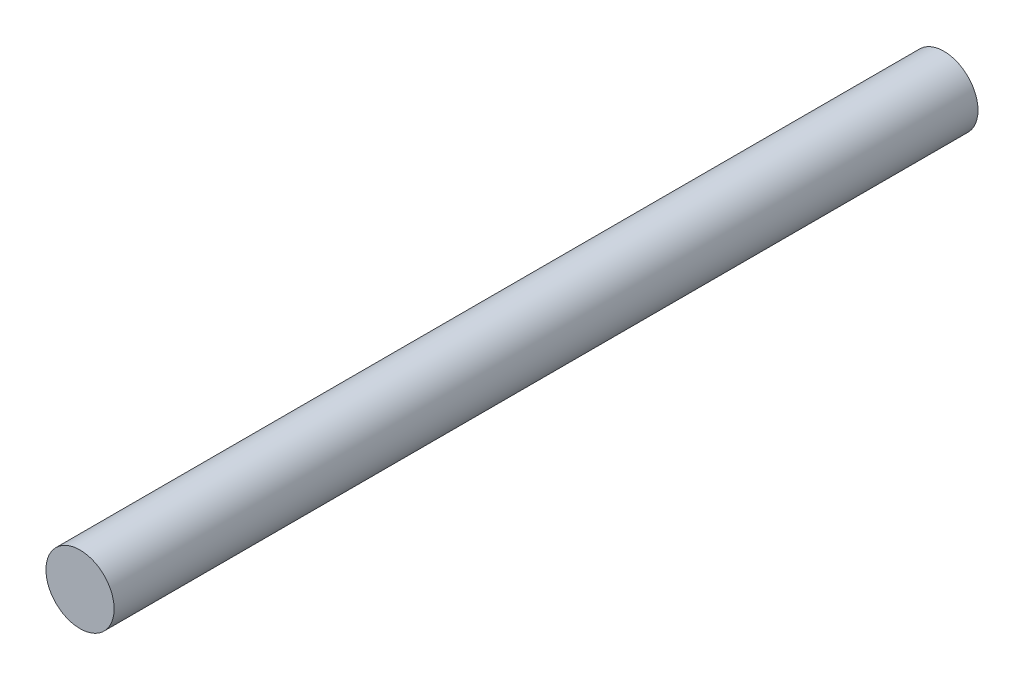
ISO-10303-21;
HEADER;
FILE_DESCRIPTION(('STEP AP214'),'2;1');
FILE_NAME('part.step','',(''),(''),'','','');
FILE_SCHEMA(('AUTOMOTIVE_DESIGN { 1 0 10303 214 1 1 1 1 }'));
ENDSEC;
DATA;
#1=APPLICATION_CONTEXT('core data for automotive mechanical design processes');
#2=APPLICATION_PROTOCOL_DEFINITION('international standard','automotive_design',2000,#1);
#3=PRODUCT_CONTEXT('',#1,'mechanical');
#4=PRODUCT('Part','Part','',(#3));
#5=PRODUCT_RELATED_PRODUCT_CATEGORY('part','',(#4));
#6=PRODUCT_DEFINITION_FORMATION('','',#4);
#7=PRODUCT_DEFINITION_CONTEXT('part definition',#1,'design');
#8=PRODUCT_DEFINITION('design','',#6,#7);
#9=PRODUCT_DEFINITION_SHAPE('','',#8);
#10=(LENGTH_UNIT() NAMED_UNIT(*) SI_UNIT(.MILLI.,.METRE.));
#11=(NAMED_UNIT(*) PLANE_ANGLE_UNIT() SI_UNIT($,.RADIAN.));
#12=(NAMED_UNIT(*) SI_UNIT($,.STERADIAN.) SOLID_ANGLE_UNIT());
#13=UNCERTAINTY_MEASURE_WITH_UNIT(LENGTH_MEASURE(1.E-05),#10,'distance_accuracy_value','');
#14=(GEOMETRIC_REPRESENTATION_CONTEXT(3) GLOBAL_UNCERTAINTY_ASSIGNED_CONTEXT((#13)) GLOBAL_UNIT_ASSIGNED_CONTEXT((#10,
#11,#12)) REPRESENTATION_CONTEXT('',''));
#15=CARTESIAN_POINT('',(0.,0.,0.));
#16=DIRECTION('',(0.,0.,1.));
#17=DIRECTION('',(1.,0.,0.));
#18=AXIS2_PLACEMENT_3D('',#15,#16,#17);
#19=CARTESIAN_POINT('',(0.,0.,19.));
#20=DIRECTION('',(0.,0.,-1.));
#21=DIRECTION('',(-1.,0.,0.));
#22=AXIS2_PLACEMENT_3D('',#19,#20,#21);
#23=CYLINDRICAL_SURFACE('',#22,1.5);
#24=CARTESIAN_POINT('',(0.,0.,19.));
#25=DIRECTION('',(0.,0.,1.));
#26=DIRECTION('',(1.,0.,0.));
#27=AXIS2_PLACEMENT_3D('',#24,#25,#26);
#28=CIRCLE('',#27,1.5);
#29=CARTESIAN_POINT('',(1.5,0.,19.));
#30=VERTEX_POINT('',#29);
#31=EDGE_CURVE('E10',#30,#30,#28,.T.);
#32=ORIENTED_EDGE('',*,*,#31,.F.);
#33=EDGE_LOOP('',(#32));
#34=FACE_BOUND('',#33,.T.);
#35=CARTESIAN_POINT('',(0.,0.,-19.));
#36=DIRECTION('',(0.,0.,1.));
#37=DIRECTION('',(1.,0.,0.));
#38=AXIS2_PLACEMENT_3D('',#35,#36,#37);
#39=CIRCLE('',#38,1.5);
#40=CARTESIAN_POINT('',(1.5,0.,-19.));
#41=VERTEX_POINT('',#40);
#42=EDGE_CURVE('E34',#41,#41,#39,.T.);
#43=ORIENTED_EDGE('',*,*,#42,.T.);
#44=EDGE_LOOP('',(#43));
#45=FACE_BOUND('',#44,.T.);
#46=ADVANCED_FACE('F28',(#34,#45),#23,.T.);
#47=CARTESIAN_POINT('',(0.,0.,19.));
#48=DIRECTION('',(0.,0.,1.));
#49=DIRECTION('',(1.,0.,0.));
#50=AXIS2_PLACEMENT_3D('',#47,#48,#49);
#51=PLANE('',#50);
#52=ORIENTED_EDGE('',*,*,#31,.T.);
#53=EDGE_LOOP('',(#52));
#54=FACE_BOUND('',#53,.T.);
#55=ADVANCED_FACE('F43',(#54),#51,.T.);
#56=CARTESIAN_POINT('',(0.,0.,-19.));
#57=DIRECTION('',(0.,0.,1.));
#58=DIRECTION('',(1.,0.,0.));
#59=AXIS2_PLACEMENT_3D('',#56,#57,#58);
#60=PLANE('',#59);
#61=ORIENTED_EDGE('',*,*,#42,.F.);
#62=EDGE_LOOP('',(#61));
#63=FACE_BOUND('',#62,.T.);
#64=ADVANCED_FACE('F41',(#63),#60,.F.);
#65=CLOSED_SHELL('',(#46,#55,#64));
#66=MANIFOLD_SOLID_BREP('B2',#65);
#67=ADVANCED_BREP_SHAPE_REPRESENTATION('',(#18,#66),#14);
#68=SHAPE_DEFINITION_REPRESENTATION(#9,#67);
ENDSEC;
END-ISO-10303-21;
